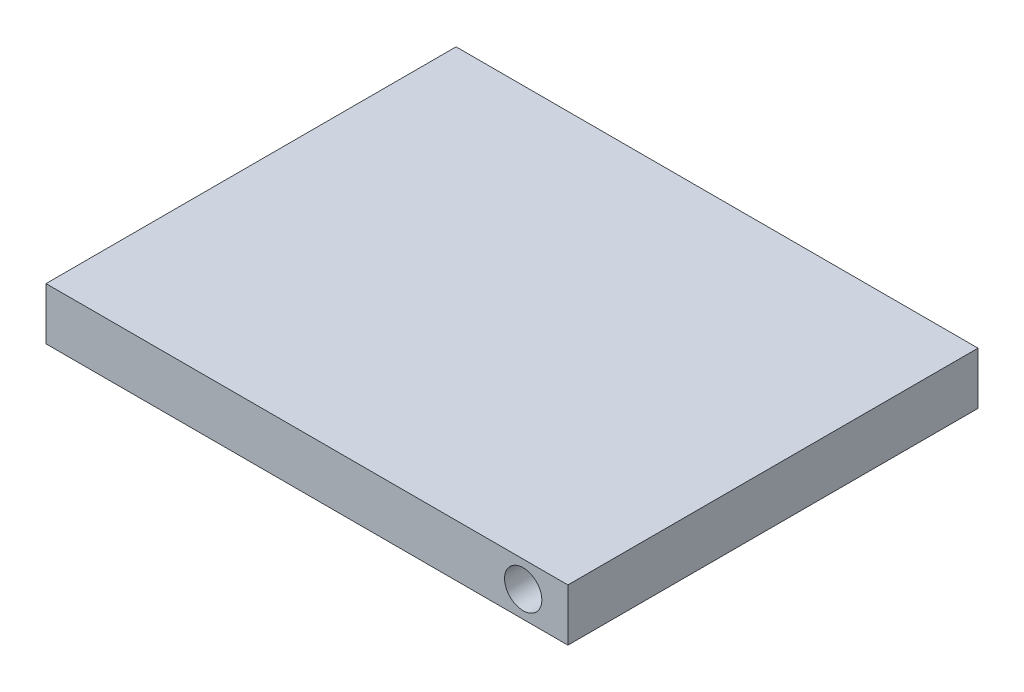
ISO-10303-21;
HEADER;
FILE_DESCRIPTION(('STEP AP214'),'2;1');
FILE_NAME('part.step','',(''),(''),'','','');
FILE_SCHEMA(('AUTOMOTIVE_DESIGN { 1 0 10303 214 1 1 1 1 }'));
ENDSEC;
DATA;
#1=APPLICATION_CONTEXT('core data for automotive mechanical design processes');
#2=APPLICATION_PROTOCOL_DEFINITION('international standard','automotive_design',2000,#1);
#3=PRODUCT_CONTEXT('',#1,'mechanical');
#4=PRODUCT('Part','Part','',(#3));
#5=PRODUCT_RELATED_PRODUCT_CATEGORY('part','',(#4));
#6=PRODUCT_DEFINITION_FORMATION('','',#4);
#7=PRODUCT_DEFINITION_CONTEXT('part definition',#1,'design');
#8=PRODUCT_DEFINITION('design','',#6,#7);
#9=PRODUCT_DEFINITION_SHAPE('','',#8);
#10=(LENGTH_UNIT() NAMED_UNIT(*) SI_UNIT(.MILLI.,.METRE.));
#11=(NAMED_UNIT(*) PLANE_ANGLE_UNIT() SI_UNIT($,.RADIAN.));
#12=(NAMED_UNIT(*) SI_UNIT($,.STERADIAN.) SOLID_ANGLE_UNIT());
#13=UNCERTAINTY_MEASURE_WITH_UNIT(LENGTH_MEASURE(1.E-05),#10,'distance_accuracy_value','');
#14=(GEOMETRIC_REPRESENTATION_CONTEXT(3) GLOBAL_UNCERTAINTY_ASSIGNED_CONTEXT((#13)) GLOBAL_UNIT_ASSIGNED_CONTEXT((#10,
#11,#12)) REPRESENTATION_CONTEXT('',''));
#15=CARTESIAN_POINT('',(0.,0.,0.));
#16=DIRECTION('',(0.,0.,1.));
#17=DIRECTION('',(1.,0.,0.));
#18=AXIS2_PLACEMENT_3D('',#15,#16,#17);
#19=CARTESIAN_POINT('',(0.,7.,0.));
#20=DIRECTION('',(1.,0.,0.));
#21=DIRECTION('',(0.,0.,-1.));
#22=AXIS2_PLACEMENT_3D('',#19,#20,#21);
#23=PLANE('',#22);
#24=DIRECTION('',(0.,0.,1.));
#25=VECTOR('',#24,1.);
#26=CARTESIAN_POINT('',(0.,0.,0.));
#27=LINE('',#26,#25);
#28=CARTESIAN_POINT('',(0.,0.,-55.));
#29=VERTEX_POINT('',#28);
#30=CARTESIAN_POINT('',(0.,0.,0.));
#31=VERTEX_POINT('',#30);
#32=EDGE_CURVE('E111',#29,#31,#27,.T.);
#33=ORIENTED_EDGE('',*,*,#32,.T.);
#34=DIRECTION('',(0.,-1.,0.));
#35=VECTOR('',#34,1.);
#36=CARTESIAN_POINT('',(0.,7.,0.));
#37=LINE('',#36,#35);
#38=CARTESIAN_POINT('',(0.,7.,0.));
#39=VERTEX_POINT('',#38);
#40=EDGE_CURVE('E11',#39,#31,#37,.T.);
#41=ORIENTED_EDGE('',*,*,#40,.F.);
#42=DIRECTION('',(0.,0.,1.));
#43=VECTOR('',#42,1.);
#44=CARTESIAN_POINT('',(0.,7.,0.));
#45=LINE('',#44,#43);
#46=CARTESIAN_POINT('',(0.,7.,-55.));
#47=VERTEX_POINT('',#46);
#48=EDGE_CURVE('E95',#47,#39,#45,.T.);
#49=ORIENTED_EDGE('',*,*,#48,.F.);
#50=DIRECTION('',(0.,-1.,0.));
#51=VECTOR('',#50,1.);
#52=CARTESIAN_POINT('',(0.,7.,-55.));
#53=LINE('',#52,#51);
#54=EDGE_CURVE('E107',#47,#29,#53,.T.);
#55=ORIENTED_EDGE('',*,*,#54,.T.);
#56=EDGE_LOOP('',(#33,#41,#49,#55));
#57=FACE_BOUND('',#56,.T.);
#58=ADVANCED_FACE('F43',(#57),#23,.F.);
#59=CARTESIAN_POINT('',(0.,7.,0.));
#60=DIRECTION('',(0.,0.,-1.));
#61=DIRECTION('',(-1.,0.,0.));
#62=AXIS2_PLACEMENT_3D('',#59,#60,#61);
#63=PLANE('',#62);
#64=CARTESIAN_POINT('',(64.,3.5,0.));
#65=DIRECTION('',(0.,0.,-1.));
#66=DIRECTION('',(-1.,0.,0.));
#67=AXIS2_PLACEMENT_3D('',#64,#65,#66);
#68=CIRCLE('',#67,2.50000000000001);
#69=CARTESIAN_POINT('',(61.5,3.5,0.));
#70=VERTEX_POINT('',#69);
#71=EDGE_CURVE('E115',#70,#70,#68,.T.);
#72=ORIENTED_EDGE('',*,*,#71,.T.);
#73=EDGE_LOOP('',(#72));
#74=FACE_BOUND('',#73,.T.);
#75=DIRECTION('',(1.,0.,0.));
#76=VECTOR('',#75,1.);
#77=CARTESIAN_POINT('',(0.,0.,0.));
#78=LINE('',#77,#76);
#79=CARTESIAN_POINT('',(70.,0.,0.));
#80=VERTEX_POINT('',#79);
#81=EDGE_CURVE('E100',#31,#80,#78,.T.);
#82=ORIENTED_EDGE('',*,*,#81,.T.);
#83=DIRECTION('',(0.,-1.,0.));
#84=VECTOR('',#83,1.);
#85=CARTESIAN_POINT('',(70.,7.,0.));
#86=LINE('',#85,#84);
#87=CARTESIAN_POINT('',(70.,7.,0.));
#88=VERTEX_POINT('',#87);
#89=EDGE_CURVE('E52',#88,#80,#86,.T.);
#90=ORIENTED_EDGE('',*,*,#89,.F.);
#91=DIRECTION('',(1.,0.,0.));
#92=VECTOR('',#91,1.);
#93=CARTESIAN_POINT('',(0.,7.,0.));
#94=LINE('',#93,#92);
#95=EDGE_CURVE('E90',#39,#88,#94,.T.);
#96=ORIENTED_EDGE('',*,*,#95,.F.);
#97=ORIENTED_EDGE('',*,*,#40,.T.);
#98=EDGE_LOOP('',(#82,#90,#96,#97));
#99=FACE_BOUND('',#98,.T.);
#100=ADVANCED_FACE('F99',(#74,#99),#63,.F.);
#101=CARTESIAN_POINT('',(70.,7.,0.));
#102=DIRECTION('',(-1.,0.,0.));
#103=DIRECTION('',(0.,0.,1.));
#104=AXIS2_PLACEMENT_3D('',#101,#102,#103);
#105=PLANE('',#104);
#106=DIRECTION('',(0.,0.,-1.));
#107=VECTOR('',#106,1.);
#108=CARTESIAN_POINT('',(70.,0.,0.));
#109=LINE('',#108,#107);
#110=CARTESIAN_POINT('',(70.,0.,-55.));
#111=VERTEX_POINT('',#110);
#112=EDGE_CURVE('E77',#80,#111,#109,.T.);
#113=ORIENTED_EDGE('',*,*,#112,.T.);
#114=DIRECTION('',(0.,-1.,0.));
#115=VECTOR('',#114,1.);
#116=CARTESIAN_POINT('',(70.,7.,-55.));
#117=LINE('',#116,#115);
#118=CARTESIAN_POINT('',(70.,7.,-55.));
#119=VERTEX_POINT('',#118);
#120=EDGE_CURVE('E102',#119,#111,#117,.T.);
#121=ORIENTED_EDGE('',*,*,#120,.F.);
#122=DIRECTION('',(0.,0.,-1.));
#123=VECTOR('',#122,1.);
#124=CARTESIAN_POINT('',(70.,7.,0.));
#125=LINE('',#124,#123);
#126=EDGE_CURVE('E93',#88,#119,#125,.T.);
#127=ORIENTED_EDGE('',*,*,#126,.F.);
#128=ORIENTED_EDGE('',*,*,#89,.T.);
#129=EDGE_LOOP('',(#113,#121,#127,#128));
#130=FACE_BOUND('',#129,.T.);
#131=ADVANCED_FACE('F103',(#130),#105,.F.);
#132=CARTESIAN_POINT('',(0.,7.,-55.));
#133=DIRECTION('',(0.,0.,1.));
#134=DIRECTION('',(1.,0.,0.));
#135=AXIS2_PLACEMENT_3D('',#132,#133,#134);
#136=PLANE('',#135);
#137=CARTESIAN_POINT('',(64.,3.5,-55.));
#138=DIRECTION('',(0.,0.,-1.));
#139=DIRECTION('',(-1.,0.,0.));
#140=AXIS2_PLACEMENT_3D('',#137,#138,#139);
#141=CIRCLE('',#140,2.50000000000001);
#142=CARTESIAN_POINT('',(61.5,3.5,-55.));
#143=VERTEX_POINT('',#142);
#144=EDGE_CURVE('E135',#143,#143,#141,.T.);
#145=ORIENTED_EDGE('',*,*,#144,.F.);
#146=EDGE_LOOP('',(#145));
#147=FACE_BOUND('',#146,.T.);
#148=DIRECTION('',(-1.,0.,0.));
#149=VECTOR('',#148,1.);
#150=CARTESIAN_POINT('',(0.,0.,-55.));
#151=LINE('',#150,#149);
#152=EDGE_CURVE('E83',#111,#29,#151,.T.);
#153=ORIENTED_EDGE('',*,*,#152,.T.);
#154=ORIENTED_EDGE('',*,*,#54,.F.);
#155=DIRECTION('',(-1.,0.,0.));
#156=VECTOR('',#155,1.);
#157=CARTESIAN_POINT('',(0.,7.,-55.));
#158=LINE('',#157,#156);
#159=EDGE_CURVE('E60',#119,#47,#158,.T.);
#160=ORIENTED_EDGE('',*,*,#159,.F.);
#161=ORIENTED_EDGE('',*,*,#120,.T.);
#162=EDGE_LOOP('',(#153,#154,#160,#161));
#163=FACE_BOUND('',#162,.T.);
#164=ADVANCED_FACE('F125',(#147,#163),#136,.F.);
#165=CARTESIAN_POINT('',(0.,7.,0.));
#166=DIRECTION('',(0.,-1.,0.));
#167=DIRECTION('',(0.,0.,-1.));
#168=AXIS2_PLACEMENT_3D('',#165,#166,#167);
#169=PLANE('',#168);
#170=ORIENTED_EDGE('',*,*,#48,.T.);
#171=ORIENTED_EDGE('',*,*,#95,.T.);
#172=ORIENTED_EDGE('',*,*,#126,.T.);
#173=ORIENTED_EDGE('',*,*,#159,.T.);
#174=EDGE_LOOP('',(#170,#171,#172,#173));
#175=FACE_BOUND('',#174,.T.);
#176=ADVANCED_FACE('F91',(#175),#169,.F.);
#177=CARTESIAN_POINT('',(0.,0.,0.));
#178=DIRECTION('',(0.,-1.,0.));
#179=DIRECTION('',(0.,0.,-1.));
#180=AXIS2_PLACEMENT_3D('',#177,#178,#179);
#181=PLANE('',#180);
#182=ORIENTED_EDGE('',*,*,#32,.F.);
#183=ORIENTED_EDGE('',*,*,#152,.F.);
#184=ORIENTED_EDGE('',*,*,#112,.F.);
#185=ORIENTED_EDGE('',*,*,#81,.F.);
#186=EDGE_LOOP('',(#182,#183,#184,#185));
#187=FACE_BOUND('',#186,.T.);
#188=ADVANCED_FACE('F128',(#187),#181,.T.);
#189=CARTESIAN_POINT('',(64.,3.5,45.));
#190=DIRECTION('',(0.,0.,-1.));
#191=DIRECTION('',(-1.,0.,0.));
#192=AXIS2_PLACEMENT_3D('',#189,#190,#191);
#193=CYLINDRICAL_SURFACE('',#192,2.50000000000001);
#194=ORIENTED_EDGE('',*,*,#144,.T.);
#195=EDGE_LOOP('',(#194));
#196=FACE_BOUND('',#195,.T.);
#197=ORIENTED_EDGE('',*,*,#71,.F.);
#198=EDGE_LOOP('',(#197));
#199=FACE_BOUND('',#198,.T.);
#200=ADVANCED_FACE('F140',(#196,#199),#193,.F.);
#201=CLOSED_SHELL('',(#58,#100,#131,#164,#176,#188,#200));
#202=MANIFOLD_SOLID_BREP('B2',#201);
#203=ADVANCED_BREP_SHAPE_REPRESENTATION('',(#18,#202),#14);
#204=SHAPE_DEFINITION_REPRESENTATION(#9,#203);
ENDSEC;
END-ISO-10303-21;
